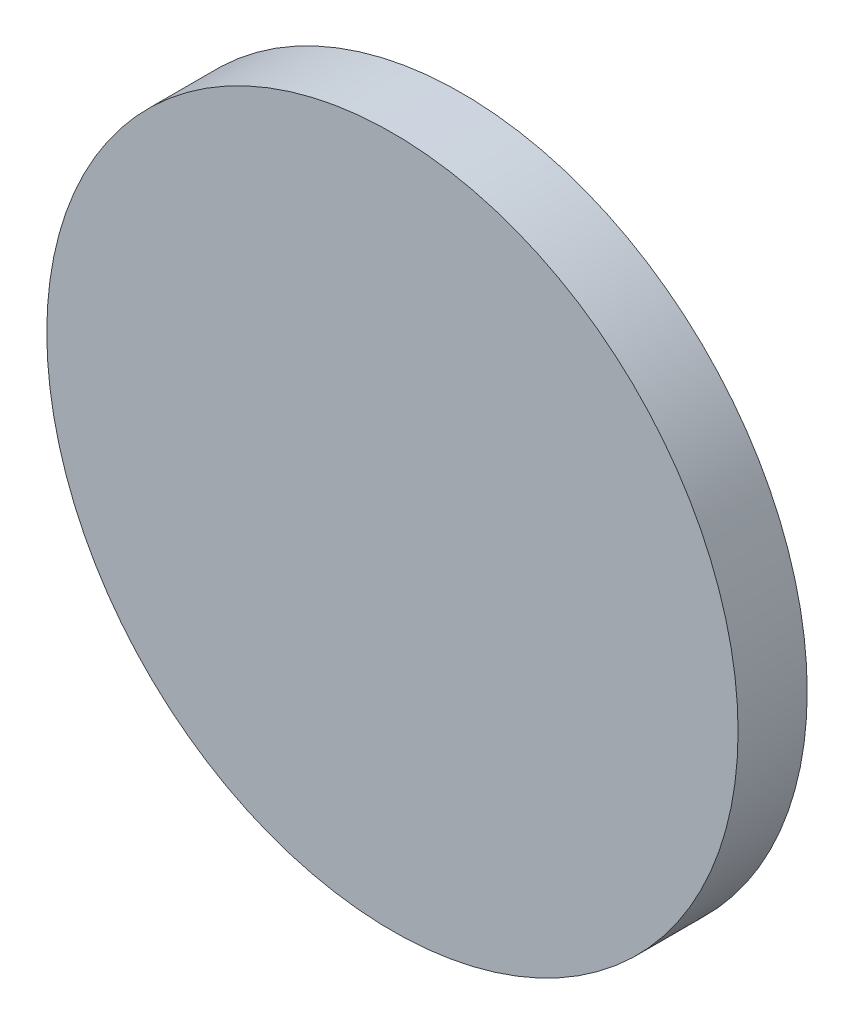
ISO-10303-21;
HEADER;
FILE_DESCRIPTION(('STEP AP214'),'2;1');
FILE_NAME('part.step','',(''),(''),'','','');
FILE_SCHEMA(('AUTOMOTIVE_DESIGN { 1 0 10303 214 1 1 1 1 }'));
ENDSEC;
DATA;
#1=APPLICATION_CONTEXT('core data for automotive mechanical design processes');
#2=APPLICATION_PROTOCOL_DEFINITION('international standard','automotive_design',2000,#1);
#3=PRODUCT_CONTEXT('',#1,'mechanical');
#4=PRODUCT('Part','Part','',(#3));
#5=PRODUCT_RELATED_PRODUCT_CATEGORY('part','',(#4));
#6=PRODUCT_DEFINITION_FORMATION('','',#4);
#7=PRODUCT_DEFINITION_CONTEXT('part definition',#1,'design');
#8=PRODUCT_DEFINITION('design','',#6,#7);
#9=PRODUCT_DEFINITION_SHAPE('','',#8);
#10=(LENGTH_UNIT() NAMED_UNIT(*) SI_UNIT(.MILLI.,.METRE.));
#11=(NAMED_UNIT(*) PLANE_ANGLE_UNIT() SI_UNIT($,.RADIAN.));
#12=(NAMED_UNIT(*) SI_UNIT($,.STERADIAN.) SOLID_ANGLE_UNIT());
#13=UNCERTAINTY_MEASURE_WITH_UNIT(LENGTH_MEASURE(1.E-05),#10,'distance_accuracy_value','');
#14=(GEOMETRIC_REPRESENTATION_CONTEXT(3) GLOBAL_UNCERTAINTY_ASSIGNED_CONTEXT((#13)) GLOBAL_UNIT_ASSIGNED_CONTEXT((#10,
#11,#12)) REPRESENTATION_CONTEXT('',''));
#15=CARTESIAN_POINT('',(0.,0.,0.));
#16=DIRECTION('',(0.,0.,1.));
#17=DIRECTION('',(1.,0.,0.));
#18=AXIS2_PLACEMENT_3D('',#15,#16,#17);
#19=CARTESIAN_POINT('',(0.,0.,6.));
#20=DIRECTION('',(0.,0.,-1.));
#21=DIRECTION('',(-1.,0.,0.));
#22=AXIS2_PLACEMENT_3D('',#19,#20,#21);
#23=CYLINDRICAL_SURFACE('',#22,30.);
#24=CARTESIAN_POINT('',(0.,0.,6.));
#25=DIRECTION('',(0.,0.,1.));
#26=DIRECTION('',(1.,0.,0.));
#27=AXIS2_PLACEMENT_3D('',#24,#25,#26);
#28=CIRCLE('',#27,30.);
#29=CARTESIAN_POINT('',(30.,0.,6.));
#30=VERTEX_POINT('',#29);
#31=EDGE_CURVE('E10',#30,#30,#28,.T.);
#32=ORIENTED_EDGE('',*,*,#31,.F.);
#33=EDGE_LOOP('',(#32));
#34=FACE_BOUND('',#33,.T.);
#35=CARTESIAN_POINT('',(0.,0.,0.));
#36=DIRECTION('',(0.,0.,1.));
#37=DIRECTION('',(1.,0.,0.));
#38=AXIS2_PLACEMENT_3D('',#35,#36,#37);
#39=CIRCLE('',#38,30.);
#40=CARTESIAN_POINT('',(30.,0.,0.));
#41=VERTEX_POINT('',#40);
#42=EDGE_CURVE('E34',#41,#41,#39,.T.);
#43=ORIENTED_EDGE('',*,*,#42,.T.);
#44=EDGE_LOOP('',(#43));
#45=FACE_BOUND('',#44,.T.);
#46=ADVANCED_FACE('F31',(#34,#45),#23,.T.);
#47=CARTESIAN_POINT('',(0.,0.,6.));
#48=DIRECTION('',(0.,0.,1.));
#49=DIRECTION('',(1.,0.,0.));
#50=AXIS2_PLACEMENT_3D('',#47,#48,#49);
#51=PLANE('',#50);
#52=ORIENTED_EDGE('',*,*,#31,.T.);
#53=EDGE_LOOP('',(#52));
#54=FACE_BOUND('',#53,.T.);
#55=ADVANCED_FACE('F46',(#54),#51,.T.);
#56=CARTESIAN_POINT('',(0.,0.,0.));
#57=DIRECTION('',(0.,0.,1.));
#58=DIRECTION('',(1.,0.,0.));
#59=AXIS2_PLACEMENT_3D('',#56,#57,#58);
#60=PLANE('',#59);
#61=ORIENTED_EDGE('',*,*,#42,.F.);
#62=EDGE_LOOP('',(#61));
#63=FACE_BOUND('',#62,.T.);
#64=ADVANCED_FACE('F44',(#63),#60,.F.);
#65=CLOSED_SHELL('',(#46,#55,#64));
#66=MANIFOLD_SOLID_BREP('B2',#65);
#67=ADVANCED_BREP_SHAPE_REPRESENTATION('',(#18,#66),#14);
#68=SHAPE_DEFINITION_REPRESENTATION(#9,#67);
ENDSEC;
END-ISO-10303-21;
